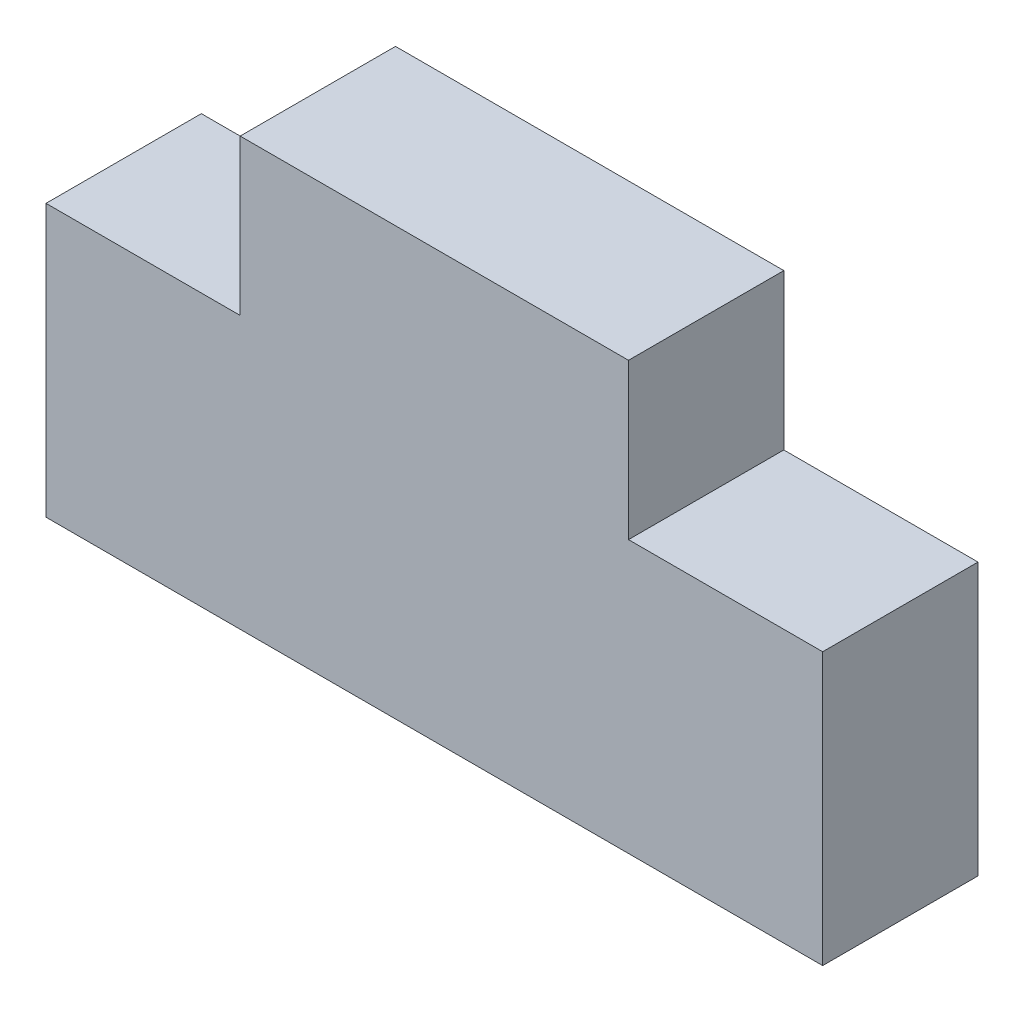
ISO-10303-21;
HEADER;
FILE_DESCRIPTION(('STEP AP214'),'2;1');
FILE_NAME('part.step','',(''),(''),'','','');
FILE_SCHEMA(('AUTOMOTIVE_DESIGN { 1 0 10303 214 1 1 1 1 }'));
ENDSEC;
DATA;
#1=APPLICATION_CONTEXT('core data for automotive mechanical design processes');
#2=APPLICATION_PROTOCOL_DEFINITION('international standard','automotive_design',2000,#1);
#3=PRODUCT_CONTEXT('',#1,'mechanical');
#4=PRODUCT('Part','Part','',(#3));
#5=PRODUCT_RELATED_PRODUCT_CATEGORY('part','',(#4));
#6=PRODUCT_DEFINITION_FORMATION('','',#4);
#7=PRODUCT_DEFINITION_CONTEXT('part definition',#1,'design');
#8=PRODUCT_DEFINITION('design','',#6,#7);
#9=PRODUCT_DEFINITION_SHAPE('','',#8);
#10=(LENGTH_UNIT() NAMED_UNIT(*) SI_UNIT(.MILLI.,.METRE.));
#11=(NAMED_UNIT(*) PLANE_ANGLE_UNIT() SI_UNIT($,.RADIAN.));
#12=(NAMED_UNIT(*) SI_UNIT($,.STERADIAN.) SOLID_ANGLE_UNIT());
#13=UNCERTAINTY_MEASURE_WITH_UNIT(LENGTH_MEASURE(1.E-05),#10,'distance_accuracy_value','');
#14=(GEOMETRIC_REPRESENTATION_CONTEXT(3) GLOBAL_UNCERTAINTY_ASSIGNED_CONTEXT((#13)) GLOBAL_UNIT_ASSIGNED_CONTEXT((#10,
#11,#12)) REPRESENTATION_CONTEXT('',''));
#15=CARTESIAN_POINT('',(0.,0.,0.));
#16=DIRECTION('',(0.,0.,1.));
#17=DIRECTION('',(1.,0.,0.));
#18=AXIS2_PLACEMENT_3D('',#15,#16,#17);
#19=CARTESIAN_POINT('',(2.5,5.5,2.));
#20=DIRECTION('',(-1.,0.,0.));
#21=DIRECTION('',(0.,-1.,0.));
#22=AXIS2_PLACEMENT_3D('',#19,#20,#21);
#23=PLANE('',#22);
#24=DIRECTION('',(0.,1.,0.));
#25=VECTOR('',#24,1.);
#26=CARTESIAN_POINT('',(2.5,5.5,0.));
#27=LINE('',#26,#25);
#28=CARTESIAN_POINT('',(2.5,3.5,0.));
#29=VERTEX_POINT('',#28);
#30=CARTESIAN_POINT('',(2.5,5.5,0.));
#31=VERTEX_POINT('',#30);
#32=EDGE_CURVE('E130',#29,#31,#27,.T.);
#33=ORIENTED_EDGE('',*,*,#32,.T.);
#34=DIRECTION('',(0.,0.,-1.));
#35=VECTOR('',#34,1.);
#36=CARTESIAN_POINT('',(2.5,5.5,2.));
#37=LINE('',#36,#35);
#38=CARTESIAN_POINT('',(2.5,5.5,2.));
#39=VERTEX_POINT('',#38);
#40=EDGE_CURVE('E11',#39,#31,#37,.T.);
#41=ORIENTED_EDGE('',*,*,#40,.F.);
#42=DIRECTION('',(0.,1.,0.));
#43=VECTOR('',#42,1.);
#44=CARTESIAN_POINT('',(2.5,5.5,2.));
#45=LINE('',#44,#43);
#46=CARTESIAN_POINT('',(2.5,3.5,2.));
#47=VERTEX_POINT('',#46);
#48=EDGE_CURVE('E144',#47,#39,#45,.T.);
#49=ORIENTED_EDGE('',*,*,#48,.F.);
#50=DIRECTION('',(0.,0.,-1.));
#51=VECTOR('',#50,1.);
#52=CARTESIAN_POINT('',(2.5,3.5,2.));
#53=LINE('',#52,#51);
#54=EDGE_CURVE('E126',#47,#29,#53,.T.);
#55=ORIENTED_EDGE('',*,*,#54,.T.);
#56=EDGE_LOOP('',(#33,#41,#49,#55));
#57=FACE_BOUND('',#56,.T.);
#58=ADVANCED_FACE('F34',(#57),#23,.F.);
#59=CARTESIAN_POINT('',(-2.5,5.5,2.));
#60=DIRECTION('',(0.,-1.,0.));
#61=DIRECTION('',(0.,0.,-1.));
#62=AXIS2_PLACEMENT_3D('',#59,#60,#61);
#63=PLANE('',#62);
#64=DIRECTION('',(-1.,0.,0.));
#65=VECTOR('',#64,1.);
#66=CARTESIAN_POINT('',(-2.5,5.5,0.));
#67=LINE('',#66,#65);
#68=CARTESIAN_POINT('',(-2.5,5.5,0.));
#69=VERTEX_POINT('',#68);
#70=EDGE_CURVE('E133',#31,#69,#67,.T.);
#71=ORIENTED_EDGE('',*,*,#70,.T.);
#72=DIRECTION('',(0.,0.,-1.));
#73=VECTOR('',#72,1.);
#74=CARTESIAN_POINT('',(-2.5,5.5,2.));
#75=LINE('',#74,#73);
#76=CARTESIAN_POINT('',(-2.5,5.5,2.));
#77=VERTEX_POINT('',#76);
#78=EDGE_CURVE('E42',#77,#69,#75,.T.);
#79=ORIENTED_EDGE('',*,*,#78,.F.);
#80=DIRECTION('',(-1.,0.,0.));
#81=VECTOR('',#80,1.);
#82=CARTESIAN_POINT('',(-2.5,5.5,2.));
#83=LINE('',#82,#81);
#84=EDGE_CURVE('E93',#39,#77,#83,.T.);
#85=ORIENTED_EDGE('',*,*,#84,.F.);
#86=ORIENTED_EDGE('',*,*,#40,.T.);
#87=EDGE_LOOP('',(#71,#79,#85,#86));
#88=FACE_BOUND('',#87,.T.);
#89=ADVANCED_FACE('F179',(#88),#63,.F.);
#90=CARTESIAN_POINT('',(-2.5,5.5,2.));
#91=DIRECTION('',(1.,0.,0.));
#92=DIRECTION('',(0.,1.,0.));
#93=AXIS2_PLACEMENT_3D('',#90,#91,#92);
#94=PLANE('',#93);
#95=DIRECTION('',(0.,-1.,0.));
#96=VECTOR('',#95,1.);
#97=CARTESIAN_POINT('',(-2.5,5.5,0.));
#98=LINE('',#97,#96);
#99=CARTESIAN_POINT('',(-2.5,3.5,0.));
#100=VERTEX_POINT('',#99);
#101=EDGE_CURVE('E135',#69,#100,#98,.T.);
#102=ORIENTED_EDGE('',*,*,#101,.T.);
#103=DIRECTION('',(0.,0.,-1.));
#104=VECTOR('',#103,1.);
#105=CARTESIAN_POINT('',(-2.5,3.5,2.));
#106=LINE('',#105,#104);
#107=CARTESIAN_POINT('',(-2.5,3.5,2.));
#108=VERTEX_POINT('',#107);
#109=EDGE_CURVE('E151',#108,#100,#106,.T.);
#110=ORIENTED_EDGE('',*,*,#109,.F.);
#111=DIRECTION('',(0.,-1.,0.));
#112=VECTOR('',#111,1.);
#113=CARTESIAN_POINT('',(-2.5,5.5,2.));
#114=LINE('',#113,#112);
#115=EDGE_CURVE('E159',#77,#108,#114,.T.);
#116=ORIENTED_EDGE('',*,*,#115,.F.);
#117=ORIENTED_EDGE('',*,*,#78,.T.);
#118=EDGE_LOOP('',(#102,#110,#116,#117));
#119=FACE_BOUND('',#118,.T.);
#120=ADVANCED_FACE('F157',(#119),#94,.F.);
#121=CARTESIAN_POINT('',(-2.5,3.5,2.));
#122=DIRECTION('',(0.,-1.,0.));
#123=DIRECTION('',(0.,0.,-1.));
#124=AXIS2_PLACEMENT_3D('',#121,#122,#123);
#125=PLANE('',#124);
#126=DIRECTION('',(-1.,0.,0.));
#127=VECTOR('',#126,1.);
#128=CARTESIAN_POINT('',(-2.5,3.5,0.));
#129=LINE('',#128,#127);
#130=CARTESIAN_POINT('',(-5.,3.5,0.));
#131=VERTEX_POINT('',#130);
#132=EDGE_CURVE('E137',#100,#131,#129,.T.);
#133=ORIENTED_EDGE('',*,*,#132,.T.);
#134=DIRECTION('',(0.,0.,-1.));
#135=VECTOR('',#134,1.);
#136=CARTESIAN_POINT('',(-5.,3.5,2.));
#137=LINE('',#136,#135);
#138=CARTESIAN_POINT('',(-5.,3.5,2.));
#139=VERTEX_POINT('',#138);
#140=EDGE_CURVE('E148',#139,#131,#137,.T.);
#141=ORIENTED_EDGE('',*,*,#140,.F.);
#142=DIRECTION('',(-1.,0.,0.));
#143=VECTOR('',#142,1.);
#144=CARTESIAN_POINT('',(-2.5,3.5,2.));
#145=LINE('',#144,#143);
#146=EDGE_CURVE('E171',#108,#139,#145,.T.);
#147=ORIENTED_EDGE('',*,*,#146,.F.);
#148=ORIENTED_EDGE('',*,*,#109,.T.);
#149=EDGE_LOOP('',(#133,#141,#147,#148));
#150=FACE_BOUND('',#149,.T.);
#151=ADVANCED_FACE('F167',(#150),#125,.F.);
#152=CARTESIAN_POINT('',(-5.,3.5,2.));
#153=DIRECTION('',(1.,0.,0.));
#154=DIRECTION('',(0.,0.,-1.));
#155=AXIS2_PLACEMENT_3D('',#152,#153,#154);
#156=PLANE('',#155);
#157=DIRECTION('',(0.,-1.,0.));
#158=VECTOR('',#157,1.);
#159=CARTESIAN_POINT('',(-5.,3.5,0.));
#160=LINE('',#159,#158);
#161=CARTESIAN_POINT('',(-5.,0.,0.));
#162=VERTEX_POINT('',#161);
#163=EDGE_CURVE('E139',#131,#162,#160,.T.);
#164=ORIENTED_EDGE('',*,*,#163,.T.);
#165=DIRECTION('',(0.,0.,-1.));
#166=VECTOR('',#165,1.);
#167=CARTESIAN_POINT('',(-5.,0.,2.));
#168=LINE('',#167,#166);
#169=CARTESIAN_POINT('',(-5.,0.,2.));
#170=VERTEX_POINT('',#169);
#171=EDGE_CURVE('E121',#170,#162,#168,.T.);
#172=ORIENTED_EDGE('',*,*,#171,.F.);
#173=DIRECTION('',(0.,-1.,0.));
#174=VECTOR('',#173,1.);
#175=CARTESIAN_POINT('',(-5.,3.5,2.));
#176=LINE('',#175,#174);
#177=EDGE_CURVE('E112',#139,#170,#176,.T.);
#178=ORIENTED_EDGE('',*,*,#177,.F.);
#179=ORIENTED_EDGE('',*,*,#140,.T.);
#180=EDGE_LOOP('',(#164,#172,#178,#179));
#181=FACE_BOUND('',#180,.T.);
#182=ADVANCED_FACE('F170',(#181),#156,.F.);
#183=CARTESIAN_POINT('',(5.,0.,2.));
#184=DIRECTION('',(0.,1.,0.));
#185=DIRECTION('',(0.,0.,1.));
#186=AXIS2_PLACEMENT_3D('',#183,#184,#185);
#187=PLANE('',#186);
#188=DIRECTION('',(1.,0.,0.));
#189=VECTOR('',#188,1.);
#190=CARTESIAN_POINT('',(5.,0.,0.));
#191=LINE('',#190,#189);
#192=CARTESIAN_POINT('',(5.,0.,0.));
#193=VERTEX_POINT('',#192);
#194=EDGE_CURVE('E120',#162,#193,#191,.T.);
#195=ORIENTED_EDGE('',*,*,#194,.T.);
#196=DIRECTION('',(0.,0.,-1.));
#197=VECTOR('',#196,1.);
#198=CARTESIAN_POINT('',(5.,0.,2.));
#199=LINE('',#198,#197);
#200=CARTESIAN_POINT('',(5.,0.,2.));
#201=VERTEX_POINT('',#200);
#202=EDGE_CURVE('E117',#201,#193,#199,.T.);
#203=ORIENTED_EDGE('',*,*,#202,.F.);
#204=DIRECTION('',(1.,0.,0.));
#205=VECTOR('',#204,1.);
#206=CARTESIAN_POINT('',(5.,0.,2.));
#207=LINE('',#206,#205);
#208=EDGE_CURVE('E106',#170,#201,#207,.T.);
#209=ORIENTED_EDGE('',*,*,#208,.F.);
#210=ORIENTED_EDGE('',*,*,#171,.T.);
#211=EDGE_LOOP('',(#195,#203,#209,#210));
#212=FACE_BOUND('',#211,.T.);
#213=ADVANCED_FACE('F118',(#212),#187,.F.);
#214=CARTESIAN_POINT('',(5.,3.5,2.));
#215=DIRECTION('',(-1.,0.,0.));
#216=DIRECTION('',(0.,0.,1.));
#217=AXIS2_PLACEMENT_3D('',#214,#215,#216);
#218=PLANE('',#217);
#219=DIRECTION('',(0.,1.,0.));
#220=VECTOR('',#219,1.);
#221=CARTESIAN_POINT('',(5.,3.5,0.));
#222=LINE('',#221,#220);
#223=CARTESIAN_POINT('',(5.,3.5,0.));
#224=VERTEX_POINT('',#223);
#225=EDGE_CURVE('E79',#193,#224,#222,.T.);
#226=ORIENTED_EDGE('',*,*,#225,.T.);
#227=DIRECTION('',(0.,0.,-1.));
#228=VECTOR('',#227,1.);
#229=CARTESIAN_POINT('',(5.,3.5,2.));
#230=LINE('',#229,#228);
#231=CARTESIAN_POINT('',(5.,3.5,2.));
#232=VERTEX_POINT('',#231);
#233=EDGE_CURVE('E122',#232,#224,#230,.T.);
#234=ORIENTED_EDGE('',*,*,#233,.F.);
#235=DIRECTION('',(0.,1.,0.));
#236=VECTOR('',#235,1.);
#237=CARTESIAN_POINT('',(5.,3.5,2.));
#238=LINE('',#237,#236);
#239=EDGE_CURVE('E110',#201,#232,#238,.T.);
#240=ORIENTED_EDGE('',*,*,#239,.F.);
#241=ORIENTED_EDGE('',*,*,#202,.T.);
#242=EDGE_LOOP('',(#226,#234,#240,#241));
#243=FACE_BOUND('',#242,.T.);
#244=ADVANCED_FACE('F124',(#243),#218,.F.);
#245=CARTESIAN_POINT('',(2.5,3.5,2.));
#246=DIRECTION('',(0.,-1.,0.));
#247=DIRECTION('',(0.,0.,-1.));
#248=AXIS2_PLACEMENT_3D('',#245,#246,#247);
#249=PLANE('',#248);
#250=DIRECTION('',(-1.,0.,0.));
#251=VECTOR('',#250,1.);
#252=CARTESIAN_POINT('',(2.5,3.5,0.));
#253=LINE('',#252,#251);
#254=EDGE_CURVE('E85',#224,#29,#253,.T.);
#255=ORIENTED_EDGE('',*,*,#254,.T.);
#256=ORIENTED_EDGE('',*,*,#54,.F.);
#257=DIRECTION('',(-1.,0.,0.));
#258=VECTOR('',#257,1.);
#259=CARTESIAN_POINT('',(2.5,3.5,2.));
#260=LINE('',#259,#258);
#261=EDGE_CURVE('E50',#232,#47,#260,.T.);
#262=ORIENTED_EDGE('',*,*,#261,.F.);
#263=ORIENTED_EDGE('',*,*,#233,.T.);
#264=EDGE_LOOP('',(#255,#256,#262,#263));
#265=FACE_BOUND('',#264,.T.);
#266=ADVANCED_FACE('F195',(#265),#249,.F.);
#267=CARTESIAN_POINT('',(0.,0.,2.));
#268=DIRECTION('',(0.,0.,1.));
#269=DIRECTION('',(1.,0.,0.));
#270=AXIS2_PLACEMENT_3D('',#267,#268,#269);
#271=PLANE('',#270);
#272=ORIENTED_EDGE('',*,*,#48,.T.);
#273=ORIENTED_EDGE('',*,*,#84,.T.);
#274=ORIENTED_EDGE('',*,*,#115,.T.);
#275=ORIENTED_EDGE('',*,*,#146,.T.);
#276=ORIENTED_EDGE('',*,*,#177,.T.);
#277=ORIENTED_EDGE('',*,*,#208,.T.);
#278=ORIENTED_EDGE('',*,*,#239,.T.);
#279=ORIENTED_EDGE('',*,*,#261,.T.);
#280=EDGE_LOOP('',(#272,#273,#274,#275,#276,#277,#278,#279));
#281=FACE_BOUND('',#280,.T.);
#282=ADVANCED_FACE('F108',(#281),#271,.T.);
#283=CARTESIAN_POINT('',(0.,0.,0.));
#284=DIRECTION('',(0.,0.,1.));
#285=DIRECTION('',(1.,0.,0.));
#286=AXIS2_PLACEMENT_3D('',#283,#284,#285);
#287=PLANE('',#286);
#288=ORIENTED_EDGE('',*,*,#32,.F.);
#289=ORIENTED_EDGE('',*,*,#254,.F.);
#290=ORIENTED_EDGE('',*,*,#225,.F.);
#291=ORIENTED_EDGE('',*,*,#194,.F.);
#292=ORIENTED_EDGE('',*,*,#163,.F.);
#293=ORIENTED_EDGE('',*,*,#132,.F.);
#294=ORIENTED_EDGE('',*,*,#101,.F.);
#295=ORIENTED_EDGE('',*,*,#70,.F.);
#296=EDGE_LOOP('',(#288,#289,#290,#291,#292,#293,#294,#295));
#297=FACE_BOUND('',#296,.T.);
#298=ADVANCED_FACE('F163',(#297),#287,.F.);
#299=CLOSED_SHELL('',(#58,#89,#120,#151,#182,#213,#244,#266,#282,#298));
#300=MANIFOLD_SOLID_BREP('B2',#299);
#301=ADVANCED_BREP_SHAPE_REPRESENTATION('',(#18,#300),#14);
#302=SHAPE_DEFINITION_REPRESENTATION(#9,#301);
ENDSEC;
END-ISO-10303-21;
